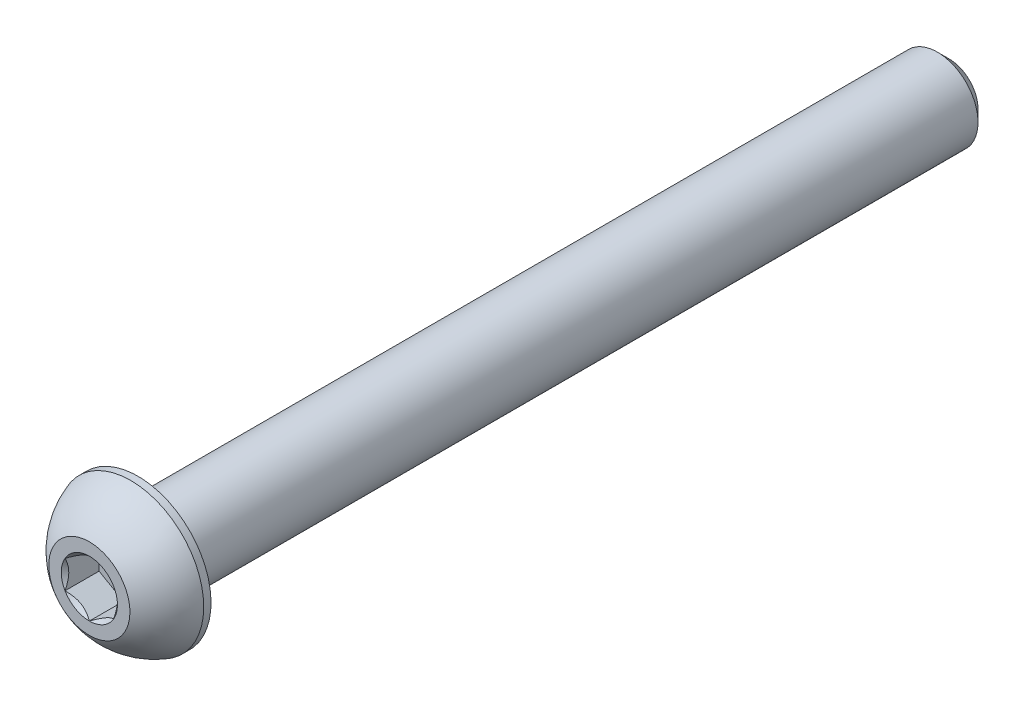
ISO-10303-21;
HEADER;
FILE_DESCRIPTION(('STEP AP214'),'2;1');
FILE_NAME('part.step','',(''),(''),'','','');
FILE_SCHEMA(('AUTOMOTIVE_DESIGN { 1 0 10303 214 1 1 1 1 }'));
ENDSEC;
DATA;
#1=APPLICATION_CONTEXT('core data for automotive mechanical design processes');
#2=APPLICATION_PROTOCOL_DEFINITION('international standard','automotive_design',2000,#1);
#3=PRODUCT_CONTEXT('',#1,'mechanical');
#4=PRODUCT('Part','Part','',(#3));
#5=PRODUCT_RELATED_PRODUCT_CATEGORY('part','',(#4));
#6=PRODUCT_DEFINITION_FORMATION('','',#4);
#7=PRODUCT_DEFINITION_CONTEXT('part definition',#1,'design');
#8=PRODUCT_DEFINITION('design','',#6,#7);
#9=PRODUCT_DEFINITION_SHAPE('','',#8);
#10=(LENGTH_UNIT() NAMED_UNIT(*) SI_UNIT(.MILLI.,.METRE.));
#11=(NAMED_UNIT(*) PLANE_ANGLE_UNIT() SI_UNIT($,.RADIAN.));
#12=(NAMED_UNIT(*) SI_UNIT($,.STERADIAN.) SOLID_ANGLE_UNIT());
#13=UNCERTAINTY_MEASURE_WITH_UNIT(LENGTH_MEASURE(1.E-05),#10,'distance_accuracy_value','');
#14=(GEOMETRIC_REPRESENTATION_CONTEXT(3) GLOBAL_UNCERTAINTY_ASSIGNED_CONTEXT((#13)) GLOBAL_UNIT_ASSIGNED_CONTEXT((#10,
#11,#12)) REPRESENTATION_CONTEXT('',''));
#15=CARTESIAN_POINT('',(0.,0.,0.));
#16=DIRECTION('',(0.,0.,1.));
#17=DIRECTION('',(1.,0.,0.));
#18=AXIS2_PLACEMENT_3D('',#15,#16,#17);
#19=CARTESIAN_POINT('',(0.,0.,13.25));
#20=DIRECTION('',(0.,0.,-1.));
#21=DIRECTION('',(0.,1.,0.));
#22=AXIS2_PLACEMENT_3D('',#19,#20,#21);
#23=PLANE('',#22);
#24=CARTESIAN_POINT('',(0.,0.,13.25));
#25=DIRECTION('',(0.,0.,1.));
#26=DIRECTION('',(1.,0.,0.));
#27=AXIS2_PLACEMENT_3D('',#24,#25,#26);
#28=CIRCLE('',#27,0.866025403784439);
#29=CARTESIAN_POINT('',(0.,0.866025403784439,13.25));
#30=VERTEX_POINT('',#29);
#31=CARTESIAN_POINT('',(-0.75,0.43301270189222,13.25));
#32=VERTEX_POINT('',#31);
#33=EDGE_CURVE('E214',#30,#32,#28,.T.);
#34=ORIENTED_EDGE('',*,*,#33,.F.);
#35=CARTESIAN_POINT('',(0.75,0.43301270189222,13.25));
#36=VERTEX_POINT('',#35);
#37=EDGE_CURVE('E216',#36,#30,#28,.T.);
#38=ORIENTED_EDGE('',*,*,#37,.F.);
#39=CARTESIAN_POINT('',(0.75,-0.433012701892219,13.25));
#40=VERTEX_POINT('',#39);
#41=EDGE_CURVE('E54',#40,#36,#28,.T.);
#42=ORIENTED_EDGE('',*,*,#41,.F.);
#43=CARTESIAN_POINT('',(0.,-0.866025403784439,13.25));
#44=VERTEX_POINT('',#43);
#45=EDGE_CURVE('E61',#44,#40,#28,.T.);
#46=ORIENTED_EDGE('',*,*,#45,.F.);
#47=CARTESIAN_POINT('',(-0.75,-0.43301270189222,13.25));
#48=VERTEX_POINT('',#47);
#49=EDGE_CURVE('E221',#48,#44,#28,.T.);
#50=ORIENTED_EDGE('',*,*,#49,.F.);
#51=EDGE_CURVE('E218',#32,#48,#28,.T.);
#52=ORIENTED_EDGE('',*,*,#51,.F.);
#53=EDGE_LOOP('',(#34,#38,#42,#46,#50,#52));
#54=FACE_BOUND('',#53,.T.);
#55=CARTESIAN_POINT('',(0.,0.,13.25));
#56=DIRECTION('',(0.,0.,1.));
#57=DIRECTION('',(0.,-1.,0.));
#58=AXIS2_PLACEMENT_3D('',#55,#56,#57);
#59=CIRCLE('',#58,1.25);
#60=CARTESIAN_POINT('',(0.,1.25,13.25));
#61=VERTEX_POINT('',#60);
#62=EDGE_CURVE('E48',#61,#61,#59,.T.);
#63=ORIENTED_EDGE('',*,*,#62,.T.);
#64=EDGE_LOOP('',(#63));
#65=FACE_BOUND('',#64,.T.);
#66=ADVANCED_FACE('F35',(#54,#65),#23,.F.);
#67=CARTESIAN_POINT('',(0.,0.,11.2399509803922));
#68=DIRECTION('',(0.,0.,1.));
#69=DIRECTION('',(0.,1.,0.));
#70=AXIS2_PLACEMENT_3D('',#67,#68,#69);
#71=SPHERICAL_SURFACE('',#70,2.36702282651149);
#72=CARTESIAN_POINT('',(0.,0.,11.975));
#73=DIRECTION('',(0.,0.,1.));
#74=DIRECTION('',(0.,-1.,0.));
#75=AXIS2_PLACEMENT_3D('',#72,#73,#74);
#76=CIRCLE('',#75,2.25);
#77=CARTESIAN_POINT('',(0.,2.25,11.975));
#78=VERTEX_POINT('',#77);
#79=EDGE_CURVE('E160',#78,#78,#76,.T.);
#80=CARTESIAN_POINT('',(0.,1.25,13.25));
#81=CARTESIAN_POINT('',(0.,1.26462917100962,13.2409025166105));
#82=CARTESIAN_POINT('',(0.,1.27915898996253,13.2316452735232));
#83=CARTESIAN_POINT('',(0.,1.30801307458842,13.2128157993583));
#84=CARTESIAN_POINT('',(0.,1.32233734026139,13.2032435682808));
#85=CARTESIAN_POINT('',(0.,1.35077346916084,13.1837886495408));
#86=CARTESIAN_POINT('',(0.,1.36488533238732,13.1739059618783));
#87=CARTESIAN_POINT('',(0.,1.39288993473664,13.1538348496046));
#88=CARTESIAN_POINT('',(0.,1.40678267385948,13.1436464249933));
#89=CARTESIAN_POINT('',(0.,1.4343424037668,13.1229686934238));
#90=CARTESIAN_POINT('',(0.,1.44800939455129,13.1124793864655));
#91=CARTESIAN_POINT('',(0.,1.47511111304782,13.0912048911251));
#92=CARTESIAN_POINT('',(0.,1.48854584075986,13.0804197027428));
#93=CARTESIAN_POINT('',(0.,1.51517662859343,13.0585585857515));
#94=CARTESIAN_POINT('',(0.,1.52837268871496,13.0474826571425));
#95=CARTESIAN_POINT('',(0.,1.55451985075897,13.0250453396998));
#96=CARTESIAN_POINT('',(0.,1.56747095268146,13.0136839508662));
#97=CARTESIAN_POINT('',(0.,1.59312202445558,12.9906811290014));
#98=CARTESIAN_POINT('',(0.,1.60582199430721,12.9790396959702));
#99=CARTESIAN_POINT('',(0.,1.6309647477936,12.9554823352511));
#100=CARTESIAN_POINT('',(0.,1.64340753142835,12.9435664075631));
#101=CARTESIAN_POINT('',(0.,1.66802998093452,12.9194657379202));
#102=CARTESIAN_POINT('',(0.,1.68020964680593,12.9072809959653));
#103=CARTESIAN_POINT('',(0.,1.70430005466935,12.8826485063246));
#104=CARTESIAN_POINT('',(0.,1.71621079666137,12.8702007586389));
#105=CARTESIAN_POINT('',(0.,1.73975767884732,12.845048191449));
#106=CARTESIAN_POINT('',(0.,1.75139381904126,12.8323433719448));
#107=CARTESIAN_POINT('',(0.,1.77438595061667,12.8066827175778));
#108=CARTESIAN_POINT('',(0.,1.78574194199815,12.7937268827151));
#109=CARTESIAN_POINT('',(0.,1.80816836248277,12.7675703737513));
#110=CARTESIAN_POINT('',(0.,1.81923879158591,12.7543696996504));
#111=CARTESIAN_POINT('',(0.,1.84108881017717,12.7277298050469));
#112=CARTESIAN_POINT('',(0.,1.85186839966529,12.7142905845444));
#113=CARTESIAN_POINT('',(0.,1.87313160033471,12.6871800036909));
#114=CARTESIAN_POINT('',(0.,1.883615211516,12.6735086433399));
#115=CARTESIAN_POINT('',(0.,1.90428145797454,12.6459403000049));
#116=CARTESIAN_POINT('',(0.,1.91446409325177,12.6320433170209));
#117=CARTESIAN_POINT('',(0.,1.93452353378186,12.6040303531908));
#118=CARTESIAN_POINT('',(0.,1.94440033903471,12.5899143723448));
#119=CARTESIAN_POINT('',(0.,1.96384341118664,12.5614701419594));
#120=CARTESIAN_POINT('',(0.,1.97340967808572,12.5471418924201));
#121=CARTESIAN_POINT('',(0.,1.99222711323609,12.5182799550062));
#122=CARTESIAN_POINT('',(0.,2.00147828148738,12.5037462671316));
#123=CARTESIAN_POINT('',(0.,2.01966110925757,12.4744803813394));
#124=CARTESIAN_POINT('',(0.,2.02859276877647,12.4597481834217));
#125=CARTESIAN_POINT('',(0.,2.04613232130858,12.4300923004658));
#126=CARTESIAN_POINT('',(0.,2.0547402143218,12.4151686154276));
#127=CARTESIAN_POINT('',(0.,2.07162813041181,12.3851368724369));
#128=CARTESIAN_POINT('',(0.,2.0799081534886,12.3700288144843));
#129=CARTESIAN_POINT('',(0.,2.09613638256798,12.3396355277609));
#130=CARTESIAN_POINT('',(0.,2.10408458857057,12.32435029899));
#131=CARTESIAN_POINT('',(0.,2.11964539455964,12.2936099571905));
#132=CARTESIAN_POINT('',(0.,2.12725799454612,12.2781548441618));
#133=CARTESIAN_POINT('',(0.,2.14214395948377,12.2470821013698));
#134=CARTESIAN_POINT('',(0.,2.14941732443493,12.2314644716065));
#135=CARTESIAN_POINT('',(0.,2.16362135223167,12.2000741404231));
#136=CARTESIAN_POINT('',(0.,2.17055201507725,12.1843014390029));
#137=CARTESIAN_POINT('',(0.,2.18406733408852,12.1526084832012));
#138=CARTESIAN_POINT('',(0.,2.19065199025422,12.1366882288197));
#139=CARTESIAN_POINT('',(0.,2.20347215952944,12.1047077572721));
#140=CARTESIAN_POINT('',(0.,2.20970767263897,12.0886475401061));
#141=CARTESIAN_POINT('',(0.,2.2218265737175,12.0563947956242));
#142=CARTESIAN_POINT('',(0.,2.2277099616865,12.0402022683083));
#143=CARTESIAN_POINT('',(0.,2.23912184359131,12.0076926351465));
#144=CARTESIAN_POINT('',(0.,2.24465033752712,11.9913755293007));
#145=CARTESIAN_POINT('',(0.,2.25,11.975));
#146=B_SPLINE_CURVE_WITH_KNOTS('',3,(#80,#81,#82,#83,#84,#85,#86,#87,#88,#89,#90,#91,#92,#93,
#94,#95,#96,#97,#98,#99,#100,#101,#102,#103,#104,#105,#106,#107,#108,#109,#110,#111,#112,#113,
#114,#115,#116,#117,#118,#119,#120,#121,#122,#123,#124,#125,#126,#127,#128,#129,#130,#131,#132,
#133,#134,#135,#136,#137,#138,#139,#140,#141,#142,#143,#144,#145),.UNSPECIFIED.,.F.,.F.,(4,2,2,
2,2,2,2,2,2,2,2,2,2,2,2,2,2,2,2,2,2,2,2,2,2,2,2,2,2,2,2,2,4),(0.,0.051680608702755,
0.103361217405509,0.155041826108264,0.206722434811019,0.258403043513774,0.310083652216528,
0.361764260919283,0.413444869622038,0.465125478324793,0.516806087027547,0.568486695730302,
0.620167304433056,0.671847913135812,0.723528521838566,0.775209130541321,0.826889739244077,
0.878570347946831,0.930250956649586,0.98193156535234,1.03361217405509,1.08529278275785,
1.1369733914606,1.18865400016336,1.24033460886612,1.29201521756887,1.34369582627162,
1.39537643497438,1.44705704367713,1.49873765237989,1.55041826108264,1.6020988697854,
1.65377947848815),.UNSPECIFIED.);
#147=EDGE_CURVE('BSEAM166',#61,#78,#146,.T.);
#148=ORIENTED_EDGE('',*,*,#62,.F.);
#149=ORIENTED_EDGE('',*,*,#79,.T.);
#150=ORIENTED_EDGE('',*,*,#147,.T.);
#151=ORIENTED_EDGE('',*,*,#147,.F.);
#152=EDGE_LOOP('',(#148,#150,#149,#151));
#153=FACE_BOUND('',#152,.T.);
#154=ADVANCED_FACE('F166',(#153),#71,.T.);
#155=CARTESIAN_POINT('',(0.,0.,13.25));
#156=DIRECTION('',(0.,0.,1.));
#157=DIRECTION('',(0.,-1.,0.));
#158=AXIS2_PLACEMENT_3D('',#155,#156,#157);
#159=CYLINDRICAL_SURFACE('',#158,2.25);
#160=ORIENTED_EDGE('',*,*,#79,.F.);
#161=EDGE_LOOP('',(#160));
#162=FACE_BOUND('',#161,.T.);
#163=CARTESIAN_POINT('',(0.,0.,11.75));
#164=DIRECTION('',(0.,0.,1.));
#165=DIRECTION('',(0.,-1.,0.));
#166=AXIS2_PLACEMENT_3D('',#163,#164,#165);
#167=CIRCLE('',#166,2.25);
#168=CARTESIAN_POINT('',(0.,-2.24999999999999,11.75));
#169=VERTEX_POINT('',#168);
#170=EDGE_CURVE('E157',#169,#169,#167,.T.);
#171=ORIENTED_EDGE('',*,*,#170,.T.);
#172=EDGE_LOOP('',(#171));
#173=FACE_BOUND('',#172,.T.);
#174=ADVANCED_FACE('F169',(#162,#173),#159,.T.);
#175=CARTESIAN_POINT('',(0.,1.24999999999999,11.75));
#176=DIRECTION('',(0.,0.,1.));
#177=DIRECTION('',(0.,-1.,0.));
#178=AXIS2_PLACEMENT_3D('',#175,#176,#177);
#179=PLANE('',#178);
#180=ORIENTED_EDGE('',*,*,#170,.F.);
#181=EDGE_LOOP('',(#180));
#182=FACE_BOUND('',#181,.T.);
#183=CARTESIAN_POINT('',(0.,0.,11.75));
#184=DIRECTION('',(0.,0.,1.));
#185=DIRECTION('',(0.,-1.,0.));
#186=AXIS2_PLACEMENT_3D('',#183,#184,#185);
#187=CIRCLE('',#186,1.24999999999999);
#188=CARTESIAN_POINT('',(0.,-1.24999999999999,11.75));
#189=VERTEX_POINT('',#188);
#190=EDGE_CURVE('E154',#189,#189,#187,.T.);
#191=ORIENTED_EDGE('',*,*,#190,.T.);
#192=EDGE_LOOP('',(#191));
#193=FACE_BOUND('',#192,.T.);
#194=ADVANCED_FACE('F174',(#182,#193),#179,.F.);
#195=CARTESIAN_POINT('',(0.,0.,13.25));
#196=DIRECTION('',(0.,0.,1.));
#197=DIRECTION('',(0.,-1.,0.));
#198=AXIS2_PLACEMENT_3D('',#195,#196,#197);
#199=CYLINDRICAL_SURFACE('',#198,1.24999999999999);
#200=ORIENTED_EDGE('',*,*,#190,.F.);
#201=EDGE_LOOP('',(#200));
#202=FACE_BOUND('',#201,.T.);
#203=CARTESIAN_POINT('',(0.,0.,-12.89));
#204=DIRECTION('',(0.,0.,1.));
#205=DIRECTION('',(0.,-1.,0.));
#206=AXIS2_PLACEMENT_3D('',#203,#204,#205);
#207=CIRCLE('',#206,1.25);
#208=CARTESIAN_POINT('',(0.,-1.24999999999999,-12.89));
#209=VERTEX_POINT('',#208);
#210=EDGE_CURVE('E151',#209,#209,#207,.T.);
#211=ORIENTED_EDGE('',*,*,#210,.T.);
#212=EDGE_LOOP('',(#211));
#213=FACE_BOUND('',#212,.T.);
#214=ADVANCED_FACE('F180',(#202,#213),#199,.T.);
#215=CARTESIAN_POINT('',(0.,0.,-13.25));
#216=DIRECTION('',(0.,0.,1.));
#217=DIRECTION('',(0.,-1.,0.));
#218=AXIS2_PLACEMENT_3D('',#215,#216,#217);
#219=CONICAL_SURFACE('',#218,0.889999999999999,0.785398163397445);
#220=ORIENTED_EDGE('',*,*,#210,.F.);
#221=EDGE_LOOP('',(#220));
#222=FACE_BOUND('',#221,.T.);
#223=CARTESIAN_POINT('',(0.,0.,-13.25));
#224=DIRECTION('',(0.,0.,1.));
#225=DIRECTION('',(0.,-1.,0.));
#226=AXIS2_PLACEMENT_3D('',#223,#224,#225);
#227=CIRCLE('',#226,0.889999999999999);
#228=CARTESIAN_POINT('',(0.,-0.889999999999996,-13.25));
#229=VERTEX_POINT('',#228);
#230=EDGE_CURVE('E138',#229,#229,#227,.T.);
#231=ORIENTED_EDGE('',*,*,#230,.T.);
#232=EDGE_LOOP('',(#231));
#233=FACE_BOUND('',#232,.T.);
#234=ADVANCED_FACE('F186',(#222,#233),#219,.T.);
#235=CARTESIAN_POINT('',(0.,0.,-13.25));
#236=DIRECTION('',(0.,0.,1.));
#237=DIRECTION('',(0.,-1.,0.));
#238=AXIS2_PLACEMENT_3D('',#235,#236,#237);
#239=PLANE('',#238);
#240=ORIENTED_EDGE('',*,*,#230,.F.);
#241=EDGE_LOOP('',(#240));
#242=FACE_BOUND('',#241,.T.);
#243=ADVANCED_FACE('F192',(#242),#239,.F.);
#244=CARTESIAN_POINT('',(0.,0.,13.25));
#245=DIRECTION('',(0.,0.,1.));
#246=DIRECTION('',(1.,0.,0.));
#247=AXIS2_PLACEMENT_3D('',#244,#245,#246);
#248=CONICAL_SURFACE('',#247,0.866025403784439,0.78539816339745);
#249=ORIENTED_EDGE('',*,*,#33,.T.);
#250=CARTESIAN_POINT('',(0.000199999999999791,0.866140873838277,13.2501154931448));
#251=CARTESIAN_POINT('',(-0.0255899625576818,0.851251032013209,13.2352341104639));
#252=CARTESIAN_POINT('',(-0.0518112021286597,0.836112192288419,13.221226265607));
#253=CARTESIAN_POINT('',(-0.105279708235707,0.805242135894349,13.1955775246823));
#254=CARTESIAN_POINT('',(-0.132532067460574,0.78950797895982,13.1839509117057));
#255=CARTESIAN_POINT('',(-0.187485350381354,0.757780686272653,13.1640340457722));
#256=CARTESIAN_POINT('',(-0.21517225669551,0.741795643459147,13.1556936940814));
#257=CARTESIAN_POINT('',(-0.271155595130854,0.709473647943367,13.1428427419614));
#258=CARTESIAN_POINT('',(-0.299450314843646,0.693137683900542,13.1383225405888));
#259=CARTESIAN_POINT('',(-0.348210289268844,0.664986099540474,13.1342458330974));
#260=CARTESIAN_POINT('',(-0.368612065655574,0.65320712845165,13.1336427966141));
#261=CARTESIAN_POINT('',(-0.409376134696361,0.629671982217687,13.1346545060155));
#262=CARTESIAN_POINT('',(-0.429738417651456,0.617915812672247,13.13626974099));
#263=CARTESIAN_POINT('',(-0.490534543086825,0.582815153286451,13.144336146973));
#264=CARTESIAN_POINT('',(-0.5306658549961,0.559645329552698,13.1540089358277));
#265=CARTESIAN_POINT('',(-0.601110400354027,0.518974152327358,13.1773563179723));
#266=CARTESIAN_POINT('',(-0.631753572009087,0.501282308923485,13.1898085580723));
#267=CARTESIAN_POINT('',(-0.69183934580479,0.466591771248069,13.2178596102309));
#268=CARTESIAN_POINT('',(-0.721285488381591,0.449591032904757,13.2334481859038));
#269=CARTESIAN_POINT('',(-0.7502,0.432897231838382,13.2501154931448));
#270=B_SPLINE_CURVE_WITH_KNOTS('',3,(#250,#251,#252,#253,#254,#255,#256,#257,#258,#259,#260,
#261,#262,#263,#264,#265,#266,#267,#268,#269),.UNSPECIFIED.,.F.,.F.,(4,2,2,2,2,2,2,2,2,4),(0.,
0.0999419466095604,0.200466857654447,0.299393763705718,0.398071297300231,0.468665775681749,
0.53927582139884,0.680536257244568,0.792918418368074,0.904939568716032),.UNSPECIFIED.);
#271=EDGE_CURVE('E11',#30,#32,#270,.T.);
#272=ORIENTED_EDGE('',*,*,#271,.F.);
#273=EDGE_LOOP('',(#249,#272));
#274=FACE_BOUND('',#273,.T.);
#275=ADVANCED_FACE('F197',(#274),#248,.F.);
#276=ORIENTED_EDGE('',*,*,#51,.T.);
#277=CARTESIAN_POINT('',(-0.75,-0.86360406484846,13.5277892581354));
#278=CARTESIAN_POINT('',(-0.75,-0.84257587973433,13.5119149320084));
#279=CARTESIAN_POINT('',(-0.75,-0.821430496291558,13.496196265183));
#280=CARTESIAN_POINT('',(-0.75,-0.778857857419017,13.4651345206266));
#281=CARTESIAN_POINT('',(-0.75,-0.757430533042234,13.4497915374936));
#282=CARTESIAN_POINT('',(-0.75,-0.692340710712934,13.4042035802937));
#283=CARTESIAN_POINT('',(-0.75,-0.648190081053412,13.3746440917434));
#284=CARTESIAN_POINT('',(-0.75,-0.555607181501749,13.3166155826928));
#285=CARTESIAN_POINT('',(-0.75,-0.507074363017995,13.2883051093658));
#286=CARTESIAN_POINT('',(-0.75,-0.407587529772336,13.2365181117689));
#287=CARTESIAN_POINT('',(-0.75,-0.35664241954847,13.2130252915319));
#288=CARTESIAN_POINT('',(-0.75,-0.28016546882077,13.1842868995007));
#289=CARTESIAN_POINT('',(-0.75,-0.255770023930571,13.1760392748131));
#290=CARTESIAN_POINT('',(-0.75,-0.206403277885131,13.1614971754202));
#291=CARTESIAN_POINT('',(-0.75,-0.181431937185906,13.1552028352691));
#292=CARTESIAN_POINT('',(-0.75,-0.106699879404924,13.1399931738806));
#293=CARTESIAN_POINT('',(-0.75,-0.0561907171762165,13.1343771847129));
#294=CARTESIAN_POINT('',(-0.75,0.0430767231749071,13.1336282564544));
#295=CARTESIAN_POINT('',(-0.75,0.0918322434166292,13.1381234514056));
#296=CARTESIAN_POINT('',(-0.75,0.164112195698295,13.151337307446));
#297=CARTESIAN_POINT('',(-0.75,0.188278676879437,13.1569014463821));
#298=CARTESIAN_POINT('',(-0.75,0.236094480120331,13.1699231661487));
#299=CARTESIAN_POINT('',(-0.75,0.259743845273041,13.1773805885477));
#300=CARTESIAN_POINT('',(-0.75,0.334198278463819,13.2036664694661));
#301=CARTESIAN_POINT('',(-0.75,0.383940060445495,13.2254903380484));
#302=CARTESIAN_POINT('',(-0.75,0.481089225076666,13.2740118041006));
#303=CARTESIAN_POINT('',(-0.75,0.528487417973017,13.3007269113104));
#304=CARTESIAN_POINT('',(-0.75,0.619071540465251,13.3558428511508));
#305=CARTESIAN_POINT('',(-0.75,0.662349745300239,13.3840939454522));
#306=CARTESIAN_POINT('',(-0.75,0.726111623216224,13.4277671470975));
#307=CARTESIAN_POINT('',(-0.75,0.74709041925528,13.4424788605167));
#308=CARTESIAN_POINT('',(-0.75,0.78876134150186,13.4722913841024));
#309=CARTESIAN_POINT('',(-0.75,0.80945354453562,13.487392086763));
#310=CARTESIAN_POINT('',(-0.75,0.83002639009747,13.5026540893047));
#311=B_SPLINE_CURVE_WITH_KNOTS('',3,(#277,#278,#279,#280,#281,#282,#283,#284,#285,#286,#287,
#288,#289,#290,#291,#292,#293,#294,#295,#296,#297,#298,#299,#300,#301,#302,#303,#304,#305,#306,
#307,#308,#309,#310),.UNSPECIFIED.,.F.,.F.,(4,2,2,2,2,2,2,2,2,2,2,2,2,2,2,2,4),(0.,
0.079039844312468,0.158099390497593,0.317425208674099,0.485845155681374,0.653685658303955,
0.730869805636063,0.808059268704006,0.959469653380778,1.10540290447489,1.17973203111653,
1.25405493988071,1.41653726506053,1.57961304287543,1.73458511695815,1.81145152932466,
1.8882969211581),.UNSPECIFIED.);
#312=EDGE_CURVE('E220',#32,#48,#311,.F.);
#313=ORIENTED_EDGE('',*,*,#312,.F.);
#314=EDGE_LOOP('',(#276,#313));
#315=FACE_BOUND('',#314,.T.);
#316=ADVANCED_FACE('F203',(#315),#248,.F.);
#317=ORIENTED_EDGE('',*,*,#49,.T.);
#318=CARTESIAN_POINT('',(-0.7502,-0.432897231838381,13.2501154931448));
#319=CARTESIAN_POINT('',(-0.724410037442319,-0.447787073663448,13.2352341104639));
#320=CARTESIAN_POINT('',(-0.698188797871341,-0.462925913388238,13.221226265607));
#321=CARTESIAN_POINT('',(-0.644720291764294,-0.493795969782309,13.1955775246823));
#322=CARTESIAN_POINT('',(-0.617467932539427,-0.509530126716838,13.1839509117057));
#323=CARTESIAN_POINT('',(-0.562514649618647,-0.541257419404004,13.1640340457722));
#324=CARTESIAN_POINT('',(-0.534827743304491,-0.55724246221751,13.1556936940814));
#325=CARTESIAN_POINT('',(-0.478844404869147,-0.58956445773329,13.1428427419614));
#326=CARTESIAN_POINT('',(-0.450549685156355,-0.605900421776115,13.1383225405888));
#327=CARTESIAN_POINT('',(-0.401789710731157,-0.634052006136183,13.1342458330974));
#328=CARTESIAN_POINT('',(-0.381387934344428,-0.645830977225008,13.1336427966141));
#329=CARTESIAN_POINT('',(-0.34062386530364,-0.669366123458971,13.1346545060155));
#330=CARTESIAN_POINT('',(-0.320261582348545,-0.68112229300441,13.13626974099));
#331=CARTESIAN_POINT('',(-0.259465456913176,-0.716222952390207,13.144336146973));
#332=CARTESIAN_POINT('',(-0.219334145003901,-0.739392776123959,13.1540089358277));
#333=CARTESIAN_POINT('',(-0.148889599645975,-0.780063953349299,13.1773563179723));
#334=CARTESIAN_POINT('',(-0.118246427990914,-0.797755796753172,13.1898085580723));
#335=CARTESIAN_POINT('',(-0.0581606541952103,-0.832446334428589,13.2178596102309));
#336=CARTESIAN_POINT('',(-0.0287145116184092,-0.849447072771901,13.2334481859038));
#337=CARTESIAN_POINT('',(0.000200000000000094,-0.866140873838276,13.2501154931448));
#338=B_SPLINE_CURVE_WITH_KNOTS('',3,(#318,#319,#320,#321,#322,#323,#324,#325,#326,#327,#328,
#329,#330,#331,#332,#333,#334,#335,#336,#337),.UNSPECIFIED.,.F.,.F.,(4,2,2,2,2,2,2,2,2,4),(0.,
0.0999419466095594,0.200466857654446,0.299393763705717,0.398071297300231,0.468665775681748,
0.53927582139884,0.680536257244566,0.792918418368074,0.904939568716032),.UNSPECIFIED.);
#339=EDGE_CURVE('E230',#48,#44,#338,.T.);
#340=ORIENTED_EDGE('',*,*,#339,.F.);
#341=EDGE_LOOP('',(#317,#340));
#342=FACE_BOUND('',#341,.T.);
#343=ADVANCED_FACE('F280',(#342),#248,.F.);
#344=ORIENTED_EDGE('',*,*,#45,.T.);
#345=CARTESIAN_POINT('',(-0.000200000000000112,-0.866140873838276,13.2501154931448));
#346=CARTESIAN_POINT('',(0.0255899625576811,-0.851251032013209,13.2352341104639));
#347=CARTESIAN_POINT('',(0.0518112021286588,-0.836112192288419,13.221226265607));
#348=CARTESIAN_POINT('',(0.105279708235706,-0.805242135894348,13.1955775246823));
#349=CARTESIAN_POINT('',(0.132532067460573,-0.789507978959819,13.1839509117057));
#350=CARTESIAN_POINT('',(0.187485350381353,-0.757780686272653,13.1640340457722));
#351=CARTESIAN_POINT('',(0.21517225669551,-0.741795643459147,13.1556936940814));
#352=CARTESIAN_POINT('',(0.271155595130853,-0.709473647943367,13.1428427419614));
#353=CARTESIAN_POINT('',(0.299450314843645,-0.693137683900542,13.1383225405888));
#354=CARTESIAN_POINT('',(0.348210289268844,-0.664986099540474,13.1342458330974));
#355=CARTESIAN_POINT('',(0.368612065655573,-0.653207128451649,13.1336427966141));
#356=CARTESIAN_POINT('',(0.40937613469636,-0.629671982217686,13.1346545060155));
#357=CARTESIAN_POINT('',(0.429738417651455,-0.617915812672247,13.13626974099));
#358=CARTESIAN_POINT('',(0.490534543086824,-0.582815153286451,13.144336146973));
#359=CARTESIAN_POINT('',(0.530665854996099,-0.559645329552698,13.1540089358277));
#360=CARTESIAN_POINT('',(0.601110400354026,-0.518974152327358,13.1773563179723));
#361=CARTESIAN_POINT('',(0.631753572009087,-0.501282308923484,13.1898085580723));
#362=CARTESIAN_POINT('',(0.69183934580479,-0.466591771248068,13.2178596102309));
#363=CARTESIAN_POINT('',(0.721285488381591,-0.449591032904756,13.2334481859038));
#364=CARTESIAN_POINT('',(0.7502,-0.432897231838381,13.2501154931448));
#365=B_SPLINE_CURVE_WITH_KNOTS('',3,(#345,#346,#347,#348,#349,#350,#351,#352,#353,#354,#355,
#356,#357,#358,#359,#360,#361,#362,#363,#364),.UNSPECIFIED.,.F.,.F.,(4,2,2,2,2,2,2,2,2,4),(0.,
0.0999419466095596,0.200466857654447,0.299393763705718,0.398071297300231,0.468665775681749,
0.53927582139884,0.680536257244567,0.792918418368075,0.904939568716032),.UNSPECIFIED.);
#366=EDGE_CURVE('E268',#44,#40,#365,.T.);
#367=ORIENTED_EDGE('',*,*,#366,.F.);
#368=EDGE_LOOP('',(#344,#367));
#369=FACE_BOUND('',#368,.T.);
#370=ADVANCED_FACE('F281',(#369),#248,.F.);
#371=ORIENTED_EDGE('',*,*,#41,.T.);
#372=CARTESIAN_POINT('',(0.75,-0.86360406484846,13.5277892581354));
#373=CARTESIAN_POINT('',(0.75,-0.84257587973433,13.5119149320084));
#374=CARTESIAN_POINT('',(0.75,-0.821430496291558,13.496196265183));
#375=CARTESIAN_POINT('',(0.75,-0.778857857419017,13.4651345206266));
#376=CARTESIAN_POINT('',(0.75,-0.757430533042234,13.4497915374936));
#377=CARTESIAN_POINT('',(0.75,-0.692340710712934,13.4042035802937));
#378=CARTESIAN_POINT('',(0.75,-0.648190081053412,13.3746440917434));
#379=CARTESIAN_POINT('',(0.75,-0.555607181501749,13.3166155826928));
#380=CARTESIAN_POINT('',(0.75,-0.507074363017995,13.2883051093658));
#381=CARTESIAN_POINT('',(0.75,-0.407587529772336,13.2365181117689));
#382=CARTESIAN_POINT('',(0.75,-0.35664241954847,13.2130252915319));
#383=CARTESIAN_POINT('',(0.75,-0.28016546882077,13.1842868995007));
#384=CARTESIAN_POINT('',(0.75,-0.255770023930571,13.1760392748131));
#385=CARTESIAN_POINT('',(0.75,-0.20640327788513,13.1614971754202));
#386=CARTESIAN_POINT('',(0.75,-0.181431937185906,13.1552028352691));
#387=CARTESIAN_POINT('',(0.75,-0.106699879404923,13.1399931738806));
#388=CARTESIAN_POINT('',(0.75,-0.056190717176216,13.1343771847129));
#389=CARTESIAN_POINT('',(0.75,0.0430767231749075,13.1336282564544));
#390=CARTESIAN_POINT('',(0.75,0.0918322434166293,13.1381234514056));
#391=CARTESIAN_POINT('',(0.75,0.164112195698295,13.151337307446));
#392=CARTESIAN_POINT('',(0.75,0.188278676879437,13.1569014463821));
#393=CARTESIAN_POINT('',(0.75,0.236094480120331,13.1699231661487));
#394=CARTESIAN_POINT('',(0.75,0.259743845273042,13.1773805885477));
#395=CARTESIAN_POINT('',(0.75,0.334198278463819,13.2036664694661));
#396=CARTESIAN_POINT('',(0.75,0.383940060445495,13.2254903380484));
#397=CARTESIAN_POINT('',(0.75,0.481089225076666,13.2740118041006));
#398=CARTESIAN_POINT('',(0.75,0.528487417973017,13.3007269113104));
#399=CARTESIAN_POINT('',(0.75,0.619071540465251,13.3558428511508));
#400=CARTESIAN_POINT('',(0.75,0.662349745300239,13.3840939454522));
#401=CARTESIAN_POINT('',(0.75,0.726111623216225,13.4277671470975));
#402=CARTESIAN_POINT('',(0.75,0.747090419255281,13.4424788605167));
#403=CARTESIAN_POINT('',(0.75,0.788761341501861,13.4722913841024));
#404=CARTESIAN_POINT('',(0.75,0.80945354453562,13.487392086763));
#405=CARTESIAN_POINT('',(0.75,0.830026390097469,13.5026540893047));
#406=B_SPLINE_CURVE_WITH_KNOTS('',3,(#372,#373,#374,#375,#376,#377,#378,#379,#380,#381,#382,
#383,#384,#385,#386,#387,#388,#389,#390,#391,#392,#393,#394,#395,#396,#397,#398,#399,#400,#401,
#402,#403,#404,#405),.UNSPECIFIED.,.F.,.F.,(4,2,2,2,2,2,2,2,2,2,2,2,2,2,2,2,4),(0.,
0.0790398443124681,0.158099390497593,0.317425208674099,0.485845155681375,0.653685658303955,
0.730869805636063,0.808059268704007,0.959469653380778,1.10540290447489,1.17973203111653,
1.25405493988071,1.41653726506053,1.57961304287543,1.73458511695815,1.81145152932466,
1.8882969211581),.UNSPECIFIED.);
#407=EDGE_CURVE('E120',#40,#36,#406,.T.);
#408=ORIENTED_EDGE('',*,*,#407,.F.);
#409=EDGE_LOOP('',(#371,#408));
#410=FACE_BOUND('',#409,.T.);
#411=ADVANCED_FACE('F283',(#410),#248,.F.);
#412=ORIENTED_EDGE('',*,*,#37,.T.);
#413=CARTESIAN_POINT('',(0.7502,0.432897231838382,13.2501154931448));
#414=CARTESIAN_POINT('',(0.724410037442319,0.44778707366345,13.2352341104639));
#415=CARTESIAN_POINT('',(0.698188797871341,0.462925913388239,13.221226265607));
#416=CARTESIAN_POINT('',(0.644720291764293,0.49379596978231,13.1955775246823));
#417=CARTESIAN_POINT('',(0.617467932539427,0.509530126716839,13.1839509117057));
#418=CARTESIAN_POINT('',(0.562514649618647,0.541257419404005,13.1640340457722));
#419=CARTESIAN_POINT('',(0.53482774330449,0.557242462217511,13.1556936940814));
#420=CARTESIAN_POINT('',(0.478844404869147,0.589564457733291,13.1428427419614));
#421=CARTESIAN_POINT('',(0.450549685156355,0.605900421776116,13.1383225405888));
#422=CARTESIAN_POINT('',(0.401789710731157,0.634052006136184,13.1342458330974));
#423=CARTESIAN_POINT('',(0.381387934344428,0.645830977225008,13.1336427966141));
#424=CARTESIAN_POINT('',(0.34062386530364,0.669366123458972,13.1346545060155));
#425=CARTESIAN_POINT('',(0.320261582348545,0.681122293004411,13.13626974099));
#426=CARTESIAN_POINT('',(0.259465456913176,0.716222952390208,13.144336146973));
#427=CARTESIAN_POINT('',(0.219334145003901,0.73939277612396,13.1540089358277));
#428=CARTESIAN_POINT('',(0.148889599645974,0.7800639533493,13.1773563179723));
#429=CARTESIAN_POINT('',(0.118246427990913,0.797755796753173,13.1898085580723));
#430=CARTESIAN_POINT('',(0.0581606541952101,0.83244633442859,13.2178596102309));
#431=CARTESIAN_POINT('',(0.0287145116184092,0.849447072771902,13.2334481859038));
#432=CARTESIAN_POINT('',(-0.000200000000000001,0.866140873838277,13.2501154931448));
#433=B_SPLINE_CURVE_WITH_KNOTS('',3,(#413,#414,#415,#416,#417,#418,#419,#420,#421,#422,#423,
#424,#425,#426,#427,#428,#429,#430,#431,#432),.UNSPECIFIED.,.F.,.F.,(4,2,2,2,2,2,2,2,2,4),(0.,
0.0999419466095601,0.200466857654447,0.299393763705717,0.39807129730023,0.468665775681748,
0.539275821398839,0.680536257244567,0.792918418368074,0.904939568716032),.UNSPECIFIED.);
#434=EDGE_CURVE('E101',#36,#30,#433,.T.);
#435=ORIENTED_EDGE('',*,*,#434,.F.);
#436=EDGE_LOOP('',(#412,#435));
#437=FACE_BOUND('',#436,.T.);
#438=ADVANCED_FACE('F205',(#437),#248,.F.);
#439=CARTESIAN_POINT('',(0.,0.,12.2));
#440=DIRECTION('',(0.,0.,1.));
#441=DIRECTION('',(1.,0.,0.));
#442=AXIS2_PLACEMENT_3D('',#439,#440,#441);
#443=PLANE('',#442);
#444=DIRECTION('',(-0.866025403784439,0.5,0.));
#445=VECTOR('',#444,1.);
#446=CARTESIAN_POINT('',(0.75,0.43301270189222,12.2));
#447=LINE('',#446,#445);
#448=CARTESIAN_POINT('',(0.75,0.43301270189222,12.2));
#449=VERTEX_POINT('',#448);
#450=CARTESIAN_POINT('',(0.,0.866025403784439,12.2));
#451=VERTEX_POINT('',#450);
#452=EDGE_CURVE('E99',#449,#451,#447,.T.);
#453=ORIENTED_EDGE('',*,*,#452,.T.);
#454=DIRECTION('',(-0.866025403784439,-0.5,0.));
#455=VECTOR('',#454,1.);
#456=CARTESIAN_POINT('',(0.,0.866025403784439,12.2));
#457=LINE('',#456,#455);
#458=CARTESIAN_POINT('',(-0.75,0.43301270189222,12.2));
#459=VERTEX_POINT('',#458);
#460=EDGE_CURVE('E108',#451,#459,#457,.T.);
#461=ORIENTED_EDGE('',*,*,#460,.T.);
#462=DIRECTION('',(0.,-1.,0.));
#463=VECTOR('',#462,1.);
#464=CARTESIAN_POINT('',(-0.75,0.43301270189222,12.2));
#465=LINE('',#464,#463);
#466=CARTESIAN_POINT('',(-0.75,-0.433012701892219,12.2));
#467=VERTEX_POINT('',#466);
#468=EDGE_CURVE('E114',#459,#467,#465,.T.);
#469=ORIENTED_EDGE('',*,*,#468,.T.);
#470=DIRECTION('',(0.866025403784438,-0.5,0.));
#471=VECTOR('',#470,1.);
#472=CARTESIAN_POINT('',(-0.75,-0.433012701892219,12.2));
#473=LINE('',#472,#471);
#474=CARTESIAN_POINT('',(0.,-0.866025403784438,12.2));
#475=VERTEX_POINT('',#474);
#476=EDGE_CURVE('E130',#467,#475,#473,.T.);
#477=ORIENTED_EDGE('',*,*,#476,.T.);
#478=DIRECTION('',(0.866025403784439,0.5,0.));
#479=VECTOR('',#478,1.);
#480=CARTESIAN_POINT('',(0.,-0.866025403784438,12.2));
#481=LINE('',#480,#479);
#482=CARTESIAN_POINT('',(0.75,-0.433012701892219,12.2));
#483=VERTEX_POINT('',#482);
#484=EDGE_CURVE('E133',#475,#483,#481,.T.);
#485=ORIENTED_EDGE('',*,*,#484,.T.);
#486=DIRECTION('',(0.,1.,0.));
#487=VECTOR('',#486,1.);
#488=CARTESIAN_POINT('',(0.75,-0.433012701892219,12.2));
#489=LINE('',#488,#487);
#490=EDGE_CURVE('E105',#483,#449,#489,.T.);
#491=ORIENTED_EDGE('',*,*,#490,.T.);
#492=EDGE_LOOP('',(#453,#461,#469,#477,#485,#491));
#493=FACE_BOUND('',#492,.T.);
#494=ADVANCED_FACE('F116',(#493),#443,.T.);
#495=CARTESIAN_POINT('',(0.,0.866025403784439,12.2));
#496=DIRECTION('',(-0.5,0.866025403784439,0.));
#497=DIRECTION('',(-0.866025403784439,-0.5,0.));
#498=AXIS2_PLACEMENT_3D('',#495,#496,#497);
#499=PLANE('',#498);
#500=DIRECTION('',(0.,0.,1.));
#501=VECTOR('',#500,1.);
#502=CARTESIAN_POINT('',(0.,0.866025403784439,12.2));
#503=LINE('',#502,#501);
#504=EDGE_CURVE('E94',#451,#30,#503,.T.);
#505=ORIENTED_EDGE('',*,*,#504,.T.);
#506=ORIENTED_EDGE('',*,*,#271,.T.);
#507=DIRECTION('',(0.,0.,1.));
#508=VECTOR('',#507,1.);
#509=CARTESIAN_POINT('',(-0.75,0.43301270189222,12.2));
#510=LINE('',#509,#508);
#511=EDGE_CURVE('E104',#459,#32,#510,.T.);
#512=ORIENTED_EDGE('',*,*,#511,.F.);
#513=ORIENTED_EDGE('',*,*,#460,.F.);
#514=EDGE_LOOP('',(#505,#506,#512,#513));
#515=FACE_BOUND('',#514,.T.);
#516=ADVANCED_FACE('F109',(#515),#499,.F.);
#517=CARTESIAN_POINT('',(-0.75,0.43301270189222,12.2));
#518=DIRECTION('',(-1.,0.,0.));
#519=DIRECTION('',(0.,-1.,0.));
#520=AXIS2_PLACEMENT_3D('',#517,#518,#519);
#521=PLANE('',#520);
#522=ORIENTED_EDGE('',*,*,#511,.T.);
#523=ORIENTED_EDGE('',*,*,#312,.T.);
#524=DIRECTION('',(0.,0.,1.));
#525=VECTOR('',#524,1.);
#526=CARTESIAN_POINT('',(-0.75,-0.433012701892219,12.2));
#527=LINE('',#526,#525);
#528=EDGE_CURVE('E145',#467,#48,#527,.T.);
#529=ORIENTED_EDGE('',*,*,#528,.F.);
#530=ORIENTED_EDGE('',*,*,#468,.F.);
#531=EDGE_LOOP('',(#522,#523,#529,#530));
#532=FACE_BOUND('',#531,.T.);
#533=ADVANCED_FACE('F239',(#532),#521,.F.);
#534=CARTESIAN_POINT('',(-0.75,-0.433012701892219,12.2));
#535=DIRECTION('',(-0.5,-0.866025403784438,0.));
#536=DIRECTION('',(0.866025403784439,-0.5,0.));
#537=AXIS2_PLACEMENT_3D('',#534,#535,#536);
#538=PLANE('',#537);
#539=ORIENTED_EDGE('',*,*,#528,.T.);
#540=ORIENTED_EDGE('',*,*,#339,.T.);
#541=DIRECTION('',(0.,0.,1.));
#542=VECTOR('',#541,1.);
#543=CARTESIAN_POINT('',(0.,-0.866025403784438,12.2));
#544=LINE('',#543,#542);
#545=EDGE_CURVE('E142',#475,#44,#544,.T.);
#546=ORIENTED_EDGE('',*,*,#545,.F.);
#547=ORIENTED_EDGE('',*,*,#476,.F.);
#548=EDGE_LOOP('',(#539,#540,#546,#547));
#549=FACE_BOUND('',#548,.T.);
#550=ADVANCED_FACE('F242',(#549),#538,.F.);
#551=CARTESIAN_POINT('',(0.,-0.866025403784438,12.2));
#552=DIRECTION('',(0.5,-0.866025403784439,0.));
#553=DIRECTION('',(0.866025403784439,0.5,0.));
#554=AXIS2_PLACEMENT_3D('',#551,#552,#553);
#555=PLANE('',#554);
#556=ORIENTED_EDGE('',*,*,#545,.T.);
#557=ORIENTED_EDGE('',*,*,#366,.T.);
#558=DIRECTION('',(0.,0.,1.));
#559=VECTOR('',#558,1.);
#560=CARTESIAN_POINT('',(0.75,-0.433012701892219,12.2));
#561=LINE('',#560,#559);
#562=EDGE_CURVE('E139',#483,#40,#561,.T.);
#563=ORIENTED_EDGE('',*,*,#562,.F.);
#564=ORIENTED_EDGE('',*,*,#484,.F.);
#565=EDGE_LOOP('',(#556,#557,#563,#564));
#566=FACE_BOUND('',#565,.T.);
#567=ADVANCED_FACE('F254',(#566),#555,.F.);
#568=CARTESIAN_POINT('',(0.75,-0.433012701892219,12.2));
#569=DIRECTION('',(1.,0.,0.));
#570=DIRECTION('',(0.,0.,-1.));
#571=AXIS2_PLACEMENT_3D('',#568,#569,#570);
#572=PLANE('',#571);
#573=ORIENTED_EDGE('',*,*,#562,.T.);
#574=ORIENTED_EDGE('',*,*,#407,.T.);
#575=DIRECTION('',(0.,0.,1.));
#576=VECTOR('',#575,1.);
#577=CARTESIAN_POINT('',(0.75,0.43301270189222,12.2));
#578=LINE('',#577,#576);
#579=EDGE_CURVE('E136',#449,#36,#578,.T.);
#580=ORIENTED_EDGE('',*,*,#579,.F.);
#581=ORIENTED_EDGE('',*,*,#490,.F.);
#582=EDGE_LOOP('',(#573,#574,#580,#581));
#583=FACE_BOUND('',#582,.T.);
#584=ADVANCED_FACE('F250',(#583),#572,.F.);
#585=CARTESIAN_POINT('',(0.75,0.43301270189222,12.2));
#586=DIRECTION('',(0.5,0.866025403784439,0.));
#587=DIRECTION('',(-0.866025403784439,0.5,0.));
#588=AXIS2_PLACEMENT_3D('',#585,#586,#587);
#589=PLANE('',#588);
#590=ORIENTED_EDGE('',*,*,#579,.T.);
#591=ORIENTED_EDGE('',*,*,#434,.T.);
#592=ORIENTED_EDGE('',*,*,#504,.F.);
#593=ORIENTED_EDGE('',*,*,#452,.F.);
#594=EDGE_LOOP('',(#590,#591,#592,#593));
#595=FACE_BOUND('',#594,.T.);
#596=ADVANCED_FACE('F97',(#595),#589,.F.);
#597=CLOSED_SHELL('',(#66,#154,#174,#194,#214,#234,#243,#275,#316,#343,#370,#411,#438,#494,#516,
#533,#550,#567,#584,#596));
#598=MANIFOLD_SOLID_BREP('B2',#597);
#599=ADVANCED_BREP_SHAPE_REPRESENTATION('',(#18,#598),#14);
#600=SHAPE_DEFINITION_REPRESENTATION(#9,#599);
ENDSEC;
END-ISO-10303-21;
